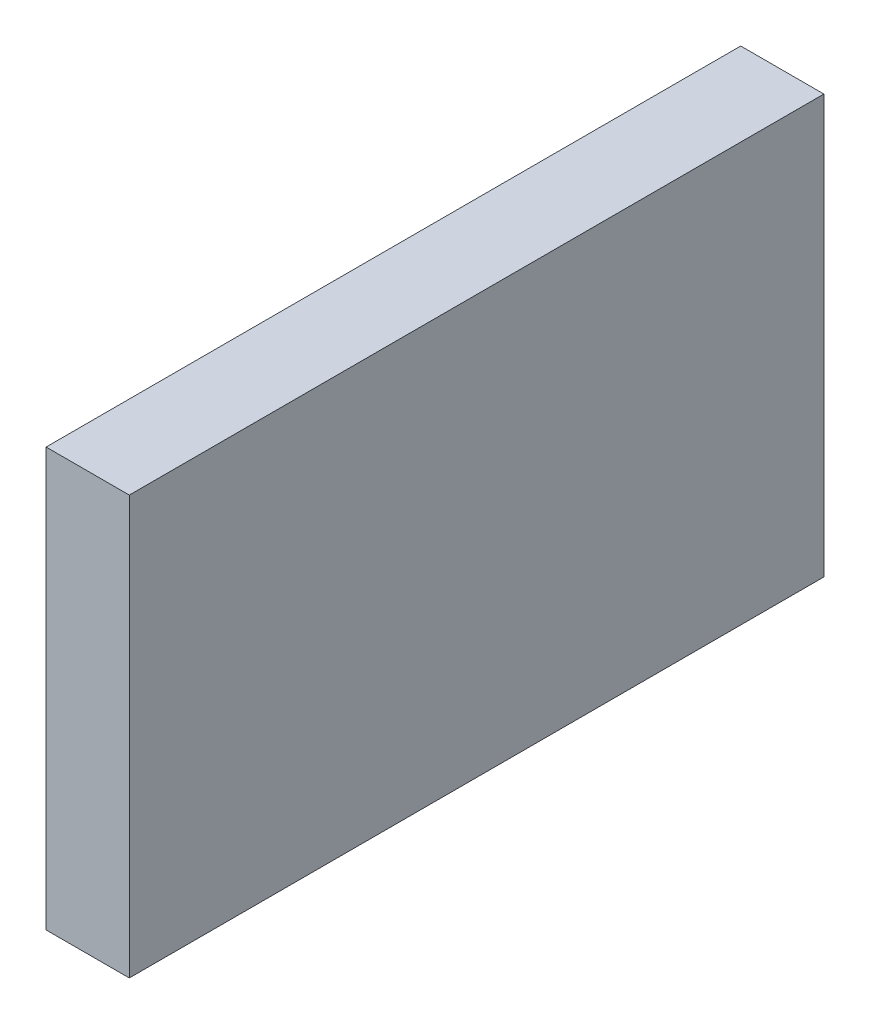
ISO-10303-21;
HEADER;
FILE_DESCRIPTION(('STEP AP214'),'2;1');
FILE_NAME('part.step','',(''),(''),'','','');
FILE_SCHEMA(('AUTOMOTIVE_DESIGN { 1 0 10303 214 1 1 1 1 }'));
ENDSEC;
DATA;
#1=APPLICATION_CONTEXT('core data for automotive mechanical design processes');
#2=APPLICATION_PROTOCOL_DEFINITION('international standard','automotive_design',2000,#1);
#3=PRODUCT_CONTEXT('',#1,'mechanical');
#4=PRODUCT('Part','Part','',(#3));
#5=PRODUCT_RELATED_PRODUCT_CATEGORY('part','',(#4));
#6=PRODUCT_DEFINITION_FORMATION('','',#4);
#7=PRODUCT_DEFINITION_CONTEXT('part definition',#1,'design');
#8=PRODUCT_DEFINITION('design','',#6,#7);
#9=PRODUCT_DEFINITION_SHAPE('','',#8);
#10=(LENGTH_UNIT() NAMED_UNIT(*) SI_UNIT(.MILLI.,.METRE.));
#11=(NAMED_UNIT(*) PLANE_ANGLE_UNIT() SI_UNIT($,.RADIAN.));
#12=(NAMED_UNIT(*) SI_UNIT($,.STERADIAN.) SOLID_ANGLE_UNIT());
#13=UNCERTAINTY_MEASURE_WITH_UNIT(LENGTH_MEASURE(1.E-05),#10,'distance_accuracy_value','');
#14=(GEOMETRIC_REPRESENTATION_CONTEXT(3) GLOBAL_UNCERTAINTY_ASSIGNED_CONTEXT((#13)) GLOBAL_UNIT_ASSIGNED_CONTEXT((#10,
#11,#12)) REPRESENTATION_CONTEXT('',''));
#15=CARTESIAN_POINT('',(0.,0.,0.));
#16=DIRECTION('',(0.,0.,1.));
#17=DIRECTION('',(1.,0.,0.));
#18=AXIS2_PLACEMENT_3D('',#15,#16,#17);
#19=CARTESIAN_POINT('',(10.,34.6406813280229,54.892156565944));
#20=DIRECTION('',(0.,0.,-1.));
#21=DIRECTION('',(-1.,0.,0.));
#22=AXIS2_PLACEMENT_3D('',#19,#20,#21);
#23=PLANE('',#22);
#24=DIRECTION('',(0.,-1.,0.));
#25=VECTOR('',#24,1.);
#26=CARTESIAN_POINT('',(0.,34.6406813280229,54.892156565944));
#27=LINE('',#26,#25);
#28=CARTESIAN_POINT('',(0.,34.6406813280229,54.892156565944));
#29=VERTEX_POINT('',#28);
#30=CARTESIAN_POINT('',(0.,-15.632717727518,54.892156565944));
#31=VERTEX_POINT('',#30);
#32=EDGE_CURVE('E111',#29,#31,#27,.T.);
#33=ORIENTED_EDGE('',*,*,#32,.T.);
#34=DIRECTION('',(-1.,0.,0.));
#35=VECTOR('',#34,1.);
#36=CARTESIAN_POINT('',(10.,-15.632717727518,54.892156565944));
#37=LINE('',#36,#35);
#38=CARTESIAN_POINT('',(10.,-15.632717727518,54.892156565944));
#39=VERTEX_POINT('',#38);
#40=EDGE_CURVE('E11',#39,#31,#37,.T.);
#41=ORIENTED_EDGE('',*,*,#40,.F.);
#42=DIRECTION('',(0.,-1.,0.));
#43=VECTOR('',#42,1.);
#44=CARTESIAN_POINT('',(10.,34.6406813280229,54.892156565944));
#45=LINE('',#44,#43);
#46=CARTESIAN_POINT('',(10.,34.6406813280229,54.892156565944));
#47=VERTEX_POINT('',#46);
#48=EDGE_CURVE('E94',#47,#39,#45,.T.);
#49=ORIENTED_EDGE('',*,*,#48,.F.);
#50=DIRECTION('',(-1.,0.,0.));
#51=VECTOR('',#50,1.);
#52=CARTESIAN_POINT('',(10.,34.6406813280229,54.892156565944));
#53=LINE('',#52,#51);
#54=EDGE_CURVE('E62',#47,#29,#53,.T.);
#55=ORIENTED_EDGE('',*,*,#54,.T.);
#56=EDGE_LOOP('',(#33,#41,#49,#55));
#57=FACE_BOUND('',#56,.T.);
#58=ADVANCED_FACE('F44',(#57),#23,.F.);
#59=CARTESIAN_POINT('',(10.,-15.632717727518,54.892156565944));
#60=DIRECTION('',(0.,1.,0.));
#61=DIRECTION('',(0.,0.,1.));
#62=AXIS2_PLACEMENT_3D('',#59,#60,#61);
#63=PLANE('',#62);
#64=DIRECTION('',(0.,0.,-1.));
#65=VECTOR('',#64,1.);
#66=CARTESIAN_POINT('',(0.,-15.632717727518,54.892156565944));
#67=LINE('',#66,#65);
#68=CARTESIAN_POINT('',(0.,-15.632717727518,-28.6007676605728));
#69=VERTEX_POINT('',#68);
#70=EDGE_CURVE('E102',#31,#69,#67,.T.);
#71=ORIENTED_EDGE('',*,*,#70,.T.);
#72=DIRECTION('',(-1.,0.,0.));
#73=VECTOR('',#72,1.);
#74=CARTESIAN_POINT('',(10.,-15.632717727518,-28.6007676605728));
#75=LINE('',#74,#73);
#76=CARTESIAN_POINT('',(10.,-15.632717727518,-28.6007676605728));
#77=VERTEX_POINT('',#76);
#78=EDGE_CURVE('E53',#77,#69,#75,.T.);
#79=ORIENTED_EDGE('',*,*,#78,.F.);
#80=DIRECTION('',(0.,0.,-1.));
#81=VECTOR('',#80,1.);
#82=CARTESIAN_POINT('',(10.,-15.632717727518,54.892156565944));
#83=LINE('',#82,#81);
#84=EDGE_CURVE('E90',#39,#77,#83,.T.);
#85=ORIENTED_EDGE('',*,*,#84,.F.);
#86=ORIENTED_EDGE('',*,*,#40,.T.);
#87=EDGE_LOOP('',(#71,#79,#85,#86));
#88=FACE_BOUND('',#87,.T.);
#89=ADVANCED_FACE('F99',(#88),#63,.F.);
#90=CARTESIAN_POINT('',(10.,34.6406813280229,-28.6007676605728));
#91=DIRECTION('',(0.,0.,-1.));
#92=DIRECTION('',(-1.,0.,0.));
#93=AXIS2_PLACEMENT_3D('',#90,#91,#92);
#94=PLANE('',#93);
#95=DIRECTION('',(0.,-1.,0.));
#96=VECTOR('',#95,1.);
#97=CARTESIAN_POINT('',(0.,34.6406813280229,-28.6007676605728));
#98=LINE('',#97,#96);
#99=CARTESIAN_POINT('',(0.,34.6406813280229,-28.6007676605728));
#100=VERTEX_POINT('',#99);
#101=EDGE_CURVE('E119',#100,#69,#98,.T.);
#102=ORIENTED_EDGE('',*,*,#101,.F.);
#103=DIRECTION('',(-1.,0.,0.));
#104=VECTOR('',#103,1.);
#105=CARTESIAN_POINT('',(10.,34.6406813280229,-28.6007676605728));
#106=LINE('',#105,#104);
#107=CARTESIAN_POINT('',(10.,34.6406813280229,-28.6007676605728));
#108=VERTEX_POINT('',#107);
#109=EDGE_CURVE('E78',#108,#100,#106,.T.);
#110=ORIENTED_EDGE('',*,*,#109,.F.);
#111=DIRECTION('',(0.,-1.,0.));
#112=VECTOR('',#111,1.);
#113=CARTESIAN_POINT('',(10.,34.6406813280229,-28.6007676605728));
#114=LINE('',#113,#112);
#115=EDGE_CURVE('E92',#108,#77,#114,.T.);
#116=ORIENTED_EDGE('',*,*,#115,.T.);
#117=ORIENTED_EDGE('',*,*,#78,.T.);
#118=EDGE_LOOP('',(#102,#110,#116,#117));
#119=FACE_BOUND('',#118,.T.);
#120=ADVANCED_FACE('F103',(#119),#94,.T.);
#121=CARTESIAN_POINT('',(10.,34.6406813280229,54.892156565944));
#122=DIRECTION('',(0.,1.,0.));
#123=DIRECTION('',(0.,0.,1.));
#124=AXIS2_PLACEMENT_3D('',#121,#122,#123);
#125=PLANE('',#124);
#126=DIRECTION('',(0.,0.,-1.));
#127=VECTOR('',#126,1.);
#128=CARTESIAN_POINT('',(0.,34.6406813280229,54.892156565944));
#129=LINE('',#128,#127);
#130=EDGE_CURVE('E123',#29,#100,#129,.T.);
#131=ORIENTED_EDGE('',*,*,#130,.F.);
#132=ORIENTED_EDGE('',*,*,#54,.F.);
#133=DIRECTION('',(0.,0.,-1.));
#134=VECTOR('',#133,1.);
#135=CARTESIAN_POINT('',(10.,34.6406813280229,54.892156565944));
#136=LINE('',#135,#134);
#137=EDGE_CURVE('E107',#47,#108,#136,.T.);
#138=ORIENTED_EDGE('',*,*,#137,.T.);
#139=ORIENTED_EDGE('',*,*,#109,.T.);
#140=EDGE_LOOP('',(#131,#132,#138,#139));
#141=FACE_BOUND('',#140,.T.);
#142=ADVANCED_FACE('F131',(#141),#125,.T.);
#143=CARTESIAN_POINT('',(10.,0.,0.));
#144=DIRECTION('',(1.,0.,0.));
#145=DIRECTION('',(0.,0.,-1.));
#146=AXIS2_PLACEMENT_3D('',#143,#144,#145);
#147=PLANE('',#146);
#148=ORIENTED_EDGE('',*,*,#48,.T.);
#149=ORIENTED_EDGE('',*,*,#84,.T.);
#150=ORIENTED_EDGE('',*,*,#115,.F.);
#151=ORIENTED_EDGE('',*,*,#137,.F.);
#152=EDGE_LOOP('',(#148,#149,#150,#151));
#153=FACE_BOUND('',#152,.T.);
#154=ADVANCED_FACE('F91',(#153),#147,.T.);
#155=CARTESIAN_POINT('',(0.,0.,0.));
#156=DIRECTION('',(1.,0.,0.));
#157=DIRECTION('',(0.,0.,-1.));
#158=AXIS2_PLACEMENT_3D('',#155,#156,#157);
#159=PLANE('',#158);
#160=ORIENTED_EDGE('',*,*,#32,.F.);
#161=ORIENTED_EDGE('',*,*,#130,.T.);
#162=ORIENTED_EDGE('',*,*,#101,.T.);
#163=ORIENTED_EDGE('',*,*,#70,.F.);
#164=EDGE_LOOP('',(#160,#161,#162,#163));
#165=FACE_BOUND('',#164,.T.);
#166=ADVANCED_FACE('F127',(#165),#159,.F.);
#167=CLOSED_SHELL('',(#58,#89,#120,#142,#154,#166));
#168=MANIFOLD_SOLID_BREP('B2',#167);
#169=ADVANCED_BREP_SHAPE_REPRESENTATION('',(#18,#168),#14);
#170=SHAPE_DEFINITION_REPRESENTATION(#9,#169);
ENDSEC;
END-ISO-10303-21;
